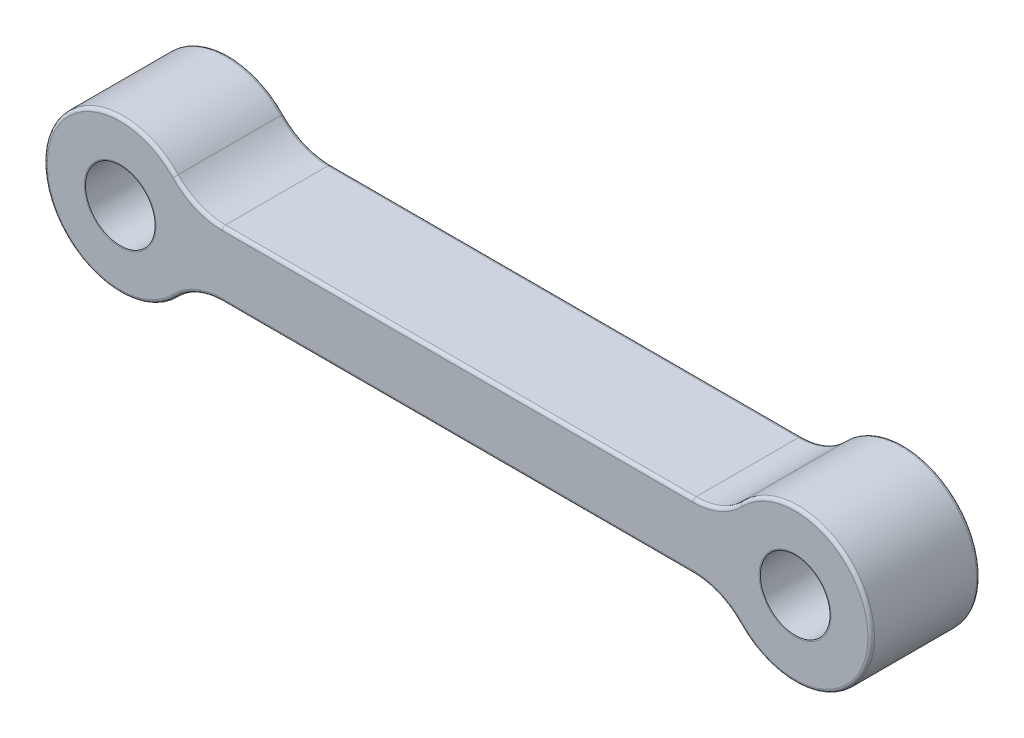
ISO-10303-21;
HEADER;
FILE_DESCRIPTION(('STEP AP214'),'2;1');
FILE_NAME('part.step','',(''),(''),'','','');
FILE_SCHEMA(('AUTOMOTIVE_DESIGN { 1 0 10303 214 1 1 1 1 }'));
ENDSEC;
DATA;
#1=APPLICATION_CONTEXT('core data for automotive mechanical design processes');
#2=APPLICATION_PROTOCOL_DEFINITION('international standard','automotive_design',2000,#1);
#3=PRODUCT_CONTEXT('',#1,'mechanical');
#4=PRODUCT('Part','Part','',(#3));
#5=PRODUCT_RELATED_PRODUCT_CATEGORY('part','',(#4));
#6=PRODUCT_DEFINITION_FORMATION('','',#4);
#7=PRODUCT_DEFINITION_CONTEXT('part definition',#1,'design');
#8=PRODUCT_DEFINITION('design','',#6,#7);
#9=PRODUCT_DEFINITION_SHAPE('','',#8);
#10=(LENGTH_UNIT() NAMED_UNIT(*) SI_UNIT(.MILLI.,.METRE.));
#11=(NAMED_UNIT(*) PLANE_ANGLE_UNIT() SI_UNIT($,.RADIAN.));
#12=(NAMED_UNIT(*) SI_UNIT($,.STERADIAN.) SOLID_ANGLE_UNIT());
#13=UNCERTAINTY_MEASURE_WITH_UNIT(LENGTH_MEASURE(1.E-05),#10,'distance_accuracy_value','');
#14=(GEOMETRIC_REPRESENTATION_CONTEXT(3) GLOBAL_UNCERTAINTY_ASSIGNED_CONTEXT((#13)) GLOBAL_UNIT_ASSIGNED_CONTEXT((#10,
#11,#12)) REPRESENTATION_CONTEXT('',''));
#15=CARTESIAN_POINT('',(0.,0.,0.));
#16=DIRECTION('',(0.,0.,1.));
#17=DIRECTION('',(1.,0.,0.));
#18=AXIS2_PLACEMENT_3D('',#15,#16,#17);
#19=CARTESIAN_POINT('',(0.,1.5,2.5));
#20=DIRECTION('',(0.,-1.,0.));
#21=DIRECTION('',(0.,0.,-1.));
#22=AXIS2_PLACEMENT_3D('',#19,#20,#21);
#23=PLANE('',#22);
#24=DIRECTION('',(0.,0.,-1.));
#25=VECTOR('',#24,1.);
#26=CARTESIAN_POINT('',(26.3095842401766,1.5,2.5));
#27=LINE('',#26,#25);
#28=CARTESIAN_POINT('',(26.3095842401766,1.5,2.35));
#29=VERTEX_POINT('',#28);
#30=CARTESIAN_POINT('',(26.3095842401766,1.5,-2.35));
#31=VERTEX_POINT('',#30);
#32=EDGE_CURVE('E295',#29,#31,#27,.T.);
#33=ORIENTED_EDGE('',*,*,#32,.T.);
#34=DIRECTION('',(-1.,0.,0.));
#35=VECTOR('',#34,1.);
#36=CARTESIAN_POINT('',(0.,1.5,-2.35));
#37=LINE('',#36,#35);
#38=CARTESIAN_POINT('',(4.69041575982343,1.5,-2.35));
#39=VERTEX_POINT('',#38);
#40=EDGE_CURVE('E220',#31,#39,#37,.T.);
#41=ORIENTED_EDGE('',*,*,#40,.T.);
#42=DIRECTION('',(0.,0.,1.));
#43=VECTOR('',#42,1.);
#44=CARTESIAN_POINT('',(4.69041575982343,1.5,2.5));
#45=LINE('',#44,#43);
#46=CARTESIAN_POINT('',(4.69041575982343,1.5,2.35));
#47=VERTEX_POINT('',#46);
#48=EDGE_CURVE('E298',#39,#47,#45,.T.);
#49=ORIENTED_EDGE('',*,*,#48,.T.);
#50=DIRECTION('',(-1.,0.,0.));
#51=VECTOR('',#50,1.);
#52=CARTESIAN_POINT('',(26.3095842401766,1.5,2.35));
#53=LINE('',#52,#51);
#54=EDGE_CURVE('E218',#47,#29,#53,.F.);
#55=ORIENTED_EDGE('',*,*,#54,.T.);
#56=EDGE_LOOP('',(#33,#41,#49,#55));
#57=FACE_BOUND('',#56,.T.);
#58=ADVANCED_FACE('F37',(#57),#23,.F.);
#59=CARTESIAN_POINT('',(0.,0.,2.5));
#60=DIRECTION('',(0.,0.,-1.));
#61=DIRECTION('',(-1.,0.,0.));
#62=AXIS2_PLACEMENT_3D('',#59,#60,#61);
#63=CYLINDRICAL_SURFACE('',#62,3.5);
#64=DIRECTION('',(0.,0.,-1.));
#65=VECTOR('',#64,1.);
#66=CARTESIAN_POINT('',(2.52560848605877,2.42307692307692,2.5));
#67=LINE('',#66,#65);
#68=CARTESIAN_POINT('',(2.52560848605877,2.42307692307692,2.35));
#69=VERTEX_POINT('',#68);
#70=CARTESIAN_POINT('',(2.52560848605877,2.42307692307692,-2.35));
#71=VERTEX_POINT('',#70);
#72=EDGE_CURVE('E292',#69,#71,#67,.T.);
#73=ORIENTED_EDGE('',*,*,#72,.T.);
#74=CARTESIAN_POINT('',(0.,0.,-2.35));
#75=DIRECTION('',(0.,0.,1.));
#76=DIRECTION('',(1.,0.,0.));
#77=AXIS2_PLACEMENT_3D('',#74,#75,#76);
#78=CIRCLE('',#77,3.5);
#79=CARTESIAN_POINT('',(2.52560848605877,-2.42307692307692,-2.35));
#80=VERTEX_POINT('',#79);
#81=EDGE_CURVE('E195',#71,#80,#78,.T.);
#82=ORIENTED_EDGE('',*,*,#81,.T.);
#83=DIRECTION('',(0.,0.,-1.));
#84=VECTOR('',#83,1.);
#85=CARTESIAN_POINT('',(2.52560848605877,-2.42307692307692,2.5));
#86=LINE('',#85,#84);
#87=CARTESIAN_POINT('',(2.52560848605877,-2.42307692307692,2.35));
#88=VERTEX_POINT('',#87);
#89=EDGE_CURVE('E255',#80,#88,#86,.F.);
#90=ORIENTED_EDGE('',*,*,#89,.T.);
#91=CARTESIAN_POINT('',(0.,0.,2.35));
#92=DIRECTION('',(0.,0.,1.));
#93=DIRECTION('',(1.,0.,0.));
#94=AXIS2_PLACEMENT_3D('',#91,#92,#93);
#95=CIRCLE('',#94,3.5);
#96=EDGE_CURVE('E193',#88,#69,#95,.F.);
#97=ORIENTED_EDGE('',*,*,#96,.T.);
#98=EDGE_LOOP('',(#73,#82,#90,#97));
#99=FACE_BOUND('',#98,.T.);
#100=ADVANCED_FACE('F335',(#99),#63,.T.);
#101=CARTESIAN_POINT('',(0.,-1.5,2.5));
#102=DIRECTION('',(0.,-1.,0.));
#103=DIRECTION('',(0.,0.,-1.));
#104=AXIS2_PLACEMENT_3D('',#101,#102,#103);
#105=PLANE('',#104);
#106=DIRECTION('',(0.,0.,-1.));
#107=VECTOR('',#106,1.);
#108=CARTESIAN_POINT('',(4.69041575982343,-1.5,2.5));
#109=LINE('',#108,#107);
#110=CARTESIAN_POINT('',(4.69041575982343,-1.5,2.35));
#111=VERTEX_POINT('',#110);
#112=CARTESIAN_POINT('',(4.69041575982343,-1.5,-2.35));
#113=VERTEX_POINT('',#112);
#114=EDGE_CURVE('E173',#111,#113,#109,.T.);
#115=ORIENTED_EDGE('',*,*,#114,.T.);
#116=DIRECTION('',(-1.,0.,0.));
#117=VECTOR('',#116,1.);
#118=CARTESIAN_POINT('',(26.3095842401766,-1.5,-2.35));
#119=LINE('',#118,#117);
#120=CARTESIAN_POINT('',(26.3095842401766,-1.5,-2.35));
#121=VERTEX_POINT('',#120);
#122=EDGE_CURVE('E203',#113,#121,#119,.F.);
#123=ORIENTED_EDGE('',*,*,#122,.T.);
#124=DIRECTION('',(0.,0.,1.));
#125=VECTOR('',#124,1.);
#126=CARTESIAN_POINT('',(26.3095842401766,-1.5,2.5));
#127=LINE('',#126,#125);
#128=CARTESIAN_POINT('',(26.3095842401766,-1.5,2.35));
#129=VERTEX_POINT('',#128);
#130=EDGE_CURVE('E307',#121,#129,#127,.T.);
#131=ORIENTED_EDGE('',*,*,#130,.T.);
#132=DIRECTION('',(-1.,0.,0.));
#133=VECTOR('',#132,1.);
#134=CARTESIAN_POINT('',(0.,-1.5,2.35));
#135=LINE('',#134,#133);
#136=EDGE_CURVE('E201',#129,#111,#135,.T.);
#137=ORIENTED_EDGE('',*,*,#136,.T.);
#138=EDGE_LOOP('',(#115,#123,#131,#137));
#139=FACE_BOUND('',#138,.T.);
#140=ADVANCED_FACE('F383',(#139),#105,.T.);
#141=CARTESIAN_POINT('',(31.,0.,2.5));
#142=DIRECTION('',(0.,0.,-1.));
#143=DIRECTION('',(-1.,0.,0.));
#144=AXIS2_PLACEMENT_3D('',#141,#142,#143);
#145=CYLINDRICAL_SURFACE('',#144,3.5);
#146=DIRECTION('',(0.,0.,-1.));
#147=VECTOR('',#146,1.);
#148=CARTESIAN_POINT('',(28.4743915139412,-2.42307692307692,2.5));
#149=LINE('',#148,#147);
#150=CARTESIAN_POINT('',(28.4743915139412,-2.42307692307692,2.35));
#151=VERTEX_POINT('',#150);
#152=CARTESIAN_POINT('',(28.4743915139412,-2.42307692307692,-2.35));
#153=VERTEX_POINT('',#152);
#154=EDGE_CURVE('E301',#151,#153,#149,.T.);
#155=ORIENTED_EDGE('',*,*,#154,.T.);
#156=CARTESIAN_POINT('',(31.,0.,-2.35));
#157=DIRECTION('',(0.,0.,1.));
#158=DIRECTION('',(1.,0.,0.));
#159=AXIS2_PLACEMENT_3D('',#156,#157,#158);
#160=CIRCLE('',#159,3.5);
#161=CARTESIAN_POINT('',(28.4743915139412,2.42307692307692,-2.35));
#162=VERTEX_POINT('',#161);
#163=EDGE_CURVE('E212',#153,#162,#160,.T.);
#164=ORIENTED_EDGE('',*,*,#163,.T.);
#165=DIRECTION('',(0.,0.,-1.));
#166=VECTOR('',#165,1.);
#167=CARTESIAN_POINT('',(28.4743915139412,2.42307692307692,2.5));
#168=LINE('',#167,#166);
#169=CARTESIAN_POINT('',(28.4743915139412,2.42307692307692,2.35));
#170=VERTEX_POINT('',#169);
#171=EDGE_CURVE('E304',#162,#170,#168,.F.);
#172=ORIENTED_EDGE('',*,*,#171,.T.);
#173=CARTESIAN_POINT('',(31.,0.,2.35));
#174=DIRECTION('',(0.,0.,1.));
#175=DIRECTION('',(1.,0.,0.));
#176=AXIS2_PLACEMENT_3D('',#173,#174,#175);
#177=CIRCLE('',#176,3.5);
#178=EDGE_CURVE('E210',#170,#151,#177,.F.);
#179=ORIENTED_EDGE('',*,*,#178,.T.);
#180=EDGE_LOOP('',(#155,#164,#172,#179));
#181=FACE_BOUND('',#180,.T.);
#182=ADVANCED_FACE('F367',(#181),#145,.T.);
#183=CARTESIAN_POINT('',(0.,0.,2.5));
#184=DIRECTION('',(0.,0.,1.));
#185=DIRECTION('',(1.,0.,0.));
#186=AXIS2_PLACEMENT_3D('',#183,#184,#185);
#187=PLANE('',#186);
#188=CARTESIAN_POINT('',(31.,0.,2.5));
#189=DIRECTION('',(0.,0.,1.));
#190=DIRECTION('',(1.,0.,0.));
#191=AXIS2_PLACEMENT_3D('',#188,#189,#190);
#192=CIRCLE('',#191,1.65);
#193=CARTESIAN_POINT('',(32.65,0.,2.5));
#194=VERTEX_POINT('',#193);
#195=EDGE_CURVE('E11',#194,#194,#192,.F.);
#196=ORIENTED_EDGE('',*,*,#195,.T.);
#197=EDGE_LOOP('',(#196));
#198=FACE_BOUND('',#197,.T.);
#199=CARTESIAN_POINT('',(0.,0.,2.5));
#200=DIRECTION('',(0.,0.,1.));
#201=DIRECTION('',(1.,0.,0.));
#202=AXIS2_PLACEMENT_3D('',#199,#200,#201);
#203=CIRCLE('',#202,1.65);
#204=CARTESIAN_POINT('',(1.65,0.,2.5));
#205=VERTEX_POINT('',#204);
#206=EDGE_CURVE('E46',#205,#205,#203,.F.);
#207=ORIENTED_EDGE('',*,*,#206,.T.);
#208=EDGE_LOOP('',(#207));
#209=FACE_BOUND('',#208,.T.);
#210=DIRECTION('',(-1.,0.,0.));
#211=VECTOR('',#210,1.);
#212=CARTESIAN_POINT('',(0.,-1.35,2.5));
#213=LINE('',#212,#211);
#214=CARTESIAN_POINT('',(4.69041575982343,-1.35,2.5));
#215=VERTEX_POINT('',#214);
#216=CARTESIAN_POINT('',(26.3095842401766,-1.35,2.5));
#217=VERTEX_POINT('',#216);
#218=EDGE_CURVE('E54',#215,#217,#213,.F.);
#219=ORIENTED_EDGE('',*,*,#218,.T.);
#220=CARTESIAN_POINT('',(26.3095842401766,-4.5,2.5));
#221=DIRECTION('',(0.,0.,1.));
#222=DIRECTION('',(1.,0.,0.));
#223=AXIS2_PLACEMENT_3D('',#220,#221,#222);
#224=CIRCLE('',#223,3.15);
#225=CARTESIAN_POINT('',(28.5826318776295,-2.31923076923077,2.5));
#226=VERTEX_POINT('',#225);
#227=EDGE_CURVE('E234',#217,#226,#224,.F.);
#228=ORIENTED_EDGE('',*,*,#227,.T.);
#229=CARTESIAN_POINT('',(31.,0.,2.5));
#230=DIRECTION('',(0.,0.,1.));
#231=DIRECTION('',(1.,0.,0.));
#232=AXIS2_PLACEMENT_3D('',#229,#230,#231);
#233=CIRCLE('',#232,3.35);
#234=CARTESIAN_POINT('',(28.5826318776295,2.31923076923077,2.5));
#235=VERTEX_POINT('',#234);
#236=EDGE_CURVE('E222',#226,#235,#233,.T.);
#237=ORIENTED_EDGE('',*,*,#236,.T.);
#238=CARTESIAN_POINT('',(26.3095842401766,4.5,2.5));
#239=DIRECTION('',(0.,0.,1.));
#240=DIRECTION('',(1.,0.,0.));
#241=AXIS2_PLACEMENT_3D('',#238,#239,#240);
#242=CIRCLE('',#241,3.15);
#243=CARTESIAN_POINT('',(26.3095842401766,1.35,2.5));
#244=VERTEX_POINT('',#243);
#245=EDGE_CURVE('E224',#235,#244,#242,.F.);
#246=ORIENTED_EDGE('',*,*,#245,.T.);
#247=DIRECTION('',(-1.,0.,0.));
#248=VECTOR('',#247,1.);
#249=CARTESIAN_POINT('',(4.69041575982343,1.35,2.5));
#250=LINE('',#249,#248);
#251=CARTESIAN_POINT('',(4.69041575982343,1.35,2.5));
#252=VERTEX_POINT('',#251);
#253=EDGE_CURVE('E226',#244,#252,#250,.T.);
#254=ORIENTED_EDGE('',*,*,#253,.T.);
#255=CARTESIAN_POINT('',(4.69041575982343,4.5,2.5));
#256=DIRECTION('',(0.,0.,1.));
#257=DIRECTION('',(1.,0.,0.));
#258=AXIS2_PLACEMENT_3D('',#255,#256,#257);
#259=CIRCLE('',#258,3.15);
#260=CARTESIAN_POINT('',(2.41736812237054,2.31923076923077,2.5));
#261=VERTEX_POINT('',#260);
#262=EDGE_CURVE('E228',#252,#261,#259,.F.);
#263=ORIENTED_EDGE('',*,*,#262,.T.);
#264=CARTESIAN_POINT('',(0.,0.,2.5));
#265=DIRECTION('',(0.,0.,1.));
#266=DIRECTION('',(1.,0.,0.));
#267=AXIS2_PLACEMENT_3D('',#264,#265,#266);
#268=CIRCLE('',#267,3.35);
#269=CARTESIAN_POINT('',(2.41736812237054,-2.31923076923077,2.5));
#270=VERTEX_POINT('',#269);
#271=EDGE_CURVE('E230',#261,#270,#268,.T.);
#272=ORIENTED_EDGE('',*,*,#271,.T.);
#273=CARTESIAN_POINT('',(4.69041575982343,-4.5,2.5));
#274=DIRECTION('',(0.,0.,1.));
#275=DIRECTION('',(1.,0.,0.));
#276=AXIS2_PLACEMENT_3D('',#273,#274,#275);
#277=CIRCLE('',#276,3.15);
#278=EDGE_CURVE('E59',#270,#215,#277,.F.);
#279=ORIENTED_EDGE('',*,*,#278,.T.);
#280=EDGE_LOOP('',(#219,#228,#237,#246,#254,#263,#272,#279));
#281=FACE_BOUND('',#280,.T.);
#282=ADVANCED_FACE('F354',(#198,#209,#281),#187,.T.);
#283=CARTESIAN_POINT('',(0.,0.,-2.5));
#284=DIRECTION('',(0.,0.,1.));
#285=DIRECTION('',(1.,0.,0.));
#286=AXIS2_PLACEMENT_3D('',#283,#284,#285);
#287=PLANE('',#286);
#288=CARTESIAN_POINT('',(31.,0.,-2.5));
#289=DIRECTION('',(0.,0.,1.));
#290=DIRECTION('',(1.,0.,0.));
#291=AXIS2_PLACEMENT_3D('',#288,#289,#290);
#292=CIRCLE('',#291,1.65);
#293=CARTESIAN_POINT('',(32.65,0.,-2.5));
#294=VERTEX_POINT('',#293);
#295=EDGE_CURVE('E182',#294,#294,#292,.T.);
#296=ORIENTED_EDGE('',*,*,#295,.T.);
#297=EDGE_LOOP('',(#296));
#298=FACE_BOUND('',#297,.T.);
#299=CARTESIAN_POINT('',(0.,0.,-2.5));
#300=DIRECTION('',(0.,0.,1.));
#301=DIRECTION('',(1.,0.,0.));
#302=AXIS2_PLACEMENT_3D('',#299,#300,#301);
#303=CIRCLE('',#302,1.65);
#304=CARTESIAN_POINT('',(1.65,0.,-2.5));
#305=VERTEX_POINT('',#304);
#306=EDGE_CURVE('E179',#305,#305,#303,.T.);
#307=ORIENTED_EDGE('',*,*,#306,.T.);
#308=EDGE_LOOP('',(#307));
#309=FACE_BOUND('',#308,.T.);
#310=CARTESIAN_POINT('',(0.,0.,-2.5));
#311=DIRECTION('',(0.,0.,1.));
#312=DIRECTION('',(1.,0.,0.));
#313=AXIS2_PLACEMENT_3D('',#310,#311,#312);
#314=CIRCLE('',#313,3.35);
#315=CARTESIAN_POINT('',(2.41736812237054,-2.31923076923077,-2.5));
#316=VERTEX_POINT('',#315);
#317=CARTESIAN_POINT('',(2.41736812237054,2.31923076923077,-2.5));
#318=VERTEX_POINT('',#317);
#319=EDGE_CURVE('E177',#316,#318,#314,.F.);
#320=ORIENTED_EDGE('',*,*,#319,.T.);
#321=CARTESIAN_POINT('',(4.69041575982343,4.5,-2.5));
#322=DIRECTION('',(0.,0.,1.));
#323=DIRECTION('',(1.,0.,0.));
#324=AXIS2_PLACEMENT_3D('',#321,#322,#323);
#325=CIRCLE('',#324,3.15);
#326=CARTESIAN_POINT('',(4.69041575982343,1.35,-2.5));
#327=VERTEX_POINT('',#326);
#328=EDGE_CURVE('E157',#318,#327,#325,.T.);
#329=ORIENTED_EDGE('',*,*,#328,.T.);
#330=DIRECTION('',(-1.,0.,0.));
#331=VECTOR('',#330,1.);
#332=CARTESIAN_POINT('',(0.,1.35,-2.5));
#333=LINE('',#332,#331);
#334=CARTESIAN_POINT('',(26.3095842401766,1.35,-2.5));
#335=VERTEX_POINT('',#334);
#336=EDGE_CURVE('E166',#327,#335,#333,.F.);
#337=ORIENTED_EDGE('',*,*,#336,.T.);
#338=CARTESIAN_POINT('',(26.3095842401766,4.5,-2.5));
#339=DIRECTION('',(0.,0.,1.));
#340=DIRECTION('',(1.,0.,0.));
#341=AXIS2_PLACEMENT_3D('',#338,#339,#340);
#342=CIRCLE('',#341,3.15);
#343=CARTESIAN_POINT('',(28.5826318776295,2.31923076923077,-2.5));
#344=VERTEX_POINT('',#343);
#345=EDGE_CURVE('E172',#335,#344,#342,.T.);
#346=ORIENTED_EDGE('',*,*,#345,.T.);
#347=CARTESIAN_POINT('',(31.,0.,-2.5));
#348=DIRECTION('',(0.,0.,1.));
#349=DIRECTION('',(1.,0.,0.));
#350=AXIS2_PLACEMENT_3D('',#347,#348,#349);
#351=CIRCLE('',#350,3.35);
#352=CARTESIAN_POINT('',(28.5826318776295,-2.31923076923077,-2.5));
#353=VERTEX_POINT('',#352);
#354=EDGE_CURVE('E313',#344,#353,#351,.F.);
#355=ORIENTED_EDGE('',*,*,#354,.T.);
#356=CARTESIAN_POINT('',(26.3095842401766,-4.5,-2.5));
#357=DIRECTION('',(0.,0.,1.));
#358=DIRECTION('',(1.,0.,0.));
#359=AXIS2_PLACEMENT_3D('',#356,#357,#358);
#360=CIRCLE('',#359,3.15);
#361=CARTESIAN_POINT('',(26.3095842401766,-1.35,-2.5));
#362=VERTEX_POINT('',#361);
#363=EDGE_CURVE('E315',#353,#362,#360,.T.);
#364=ORIENTED_EDGE('',*,*,#363,.T.);
#365=DIRECTION('',(-1.,0.,0.));
#366=VECTOR('',#365,1.);
#367=CARTESIAN_POINT('',(4.69041575982343,-1.35,-2.5));
#368=LINE('',#367,#366);
#369=CARTESIAN_POINT('',(4.69041575982343,-1.35,-2.5));
#370=VERTEX_POINT('',#369);
#371=EDGE_CURVE('E317',#362,#370,#368,.T.);
#372=ORIENTED_EDGE('',*,*,#371,.T.);
#373=CARTESIAN_POINT('',(4.69041575982343,-4.5,-2.5));
#374=DIRECTION('',(0.,0.,1.));
#375=DIRECTION('',(1.,0.,0.));
#376=AXIS2_PLACEMENT_3D('',#373,#374,#375);
#377=CIRCLE('',#376,3.15);
#378=EDGE_CURVE('E184',#370,#316,#377,.T.);
#379=ORIENTED_EDGE('',*,*,#378,.T.);
#380=EDGE_LOOP('',(#320,#329,#337,#346,#355,#364,#372,#379));
#381=FACE_BOUND('',#380,.T.);
#382=ADVANCED_FACE('F175',(#298,#309,#381),#287,.F.);
#383=CARTESIAN_POINT('',(4.69041575982343,4.5,2.5));
#384=DIRECTION('',(0.,0.,-1.));
#385=DIRECTION('',(-1.,0.,0.));
#386=AXIS2_PLACEMENT_3D('',#383,#384,#385);
#387=CYLINDRICAL_SURFACE('',#386,3.);
#388=ORIENTED_EDGE('',*,*,#48,.F.);
#389=CARTESIAN_POINT('',(4.69041575982343,4.5,-2.35));
#390=DIRECTION('',(0.,0.,1.));
#391=DIRECTION('',(1.,0.,0.));
#392=AXIS2_PLACEMENT_3D('',#389,#390,#391);
#393=CIRCLE('',#392,3.);
#394=EDGE_CURVE('E159',#39,#71,#393,.F.);
#395=ORIENTED_EDGE('',*,*,#394,.T.);
#396=ORIENTED_EDGE('',*,*,#72,.F.);
#397=CARTESIAN_POINT('',(4.69041575982343,4.5,2.35));
#398=DIRECTION('',(0.,0.,1.));
#399=DIRECTION('',(1.,0.,0.));
#400=AXIS2_PLACEMENT_3D('',#397,#398,#399);
#401=CIRCLE('',#400,3.);
#402=EDGE_CURVE('E190',#69,#47,#401,.T.);
#403=ORIENTED_EDGE('',*,*,#402,.T.);
#404=EDGE_LOOP('',(#388,#395,#396,#403));
#405=FACE_BOUND('',#404,.T.);
#406=ADVANCED_FACE('F333',(#405),#387,.F.);
#407=CARTESIAN_POINT('',(26.3095842401766,4.5,2.5));
#408=DIRECTION('',(0.,0.,-1.));
#409=DIRECTION('',(-1.,0.,0.));
#410=AXIS2_PLACEMENT_3D('',#407,#408,#409);
#411=CYLINDRICAL_SURFACE('',#410,3.);
#412=ORIENTED_EDGE('',*,*,#171,.F.);
#413=CARTESIAN_POINT('',(26.3095842401766,4.5,-2.35));
#414=DIRECTION('',(0.,0.,1.));
#415=DIRECTION('',(1.,0.,0.));
#416=AXIS2_PLACEMENT_3D('',#413,#414,#415);
#417=CIRCLE('',#416,3.);
#418=EDGE_CURVE('E216',#162,#31,#417,.F.);
#419=ORIENTED_EDGE('',*,*,#418,.T.);
#420=ORIENTED_EDGE('',*,*,#32,.F.);
#421=CARTESIAN_POINT('',(26.3095842401766,4.5,2.35));
#422=DIRECTION('',(0.,0.,1.));
#423=DIRECTION('',(1.,0.,0.));
#424=AXIS2_PLACEMENT_3D('',#421,#422,#423);
#425=CIRCLE('',#424,3.);
#426=EDGE_CURVE('E214',#29,#170,#425,.T.);
#427=ORIENTED_EDGE('',*,*,#426,.T.);
#428=EDGE_LOOP('',(#412,#419,#420,#427));
#429=FACE_BOUND('',#428,.T.);
#430=ADVANCED_FACE('F388',(#429),#411,.F.);
#431=CARTESIAN_POINT('',(4.69041575982343,-4.5,2.5));
#432=DIRECTION('',(0.,0.,-1.));
#433=DIRECTION('',(-1.,0.,0.));
#434=AXIS2_PLACEMENT_3D('',#431,#432,#433);
#435=CYLINDRICAL_SURFACE('',#434,3.);
#436=ORIENTED_EDGE('',*,*,#89,.F.);
#437=CARTESIAN_POINT('',(4.69041575982343,-4.5,-2.35));
#438=DIRECTION('',(0.,0.,1.));
#439=DIRECTION('',(1.,0.,0.));
#440=AXIS2_PLACEMENT_3D('',#437,#438,#439);
#441=CIRCLE('',#440,3.);
#442=EDGE_CURVE('E199',#80,#113,#441,.F.);
#443=ORIENTED_EDGE('',*,*,#442,.T.);
#444=ORIENTED_EDGE('',*,*,#114,.F.);
#445=CARTESIAN_POINT('',(4.69041575982343,-4.5,2.35));
#446=DIRECTION('',(0.,0.,1.));
#447=DIRECTION('',(1.,0.,0.));
#448=AXIS2_PLACEMENT_3D('',#445,#446,#447);
#449=CIRCLE('',#448,3.);
#450=EDGE_CURVE('E197',#111,#88,#449,.T.);
#451=ORIENTED_EDGE('',*,*,#450,.T.);
#452=EDGE_LOOP('',(#436,#443,#444,#451));
#453=FACE_BOUND('',#452,.T.);
#454=ADVANCED_FACE('F386',(#453),#435,.F.);
#455=CARTESIAN_POINT('',(26.3095842401766,-4.5,2.5));
#456=DIRECTION('',(0.,0.,-1.));
#457=DIRECTION('',(-1.,0.,0.));
#458=AXIS2_PLACEMENT_3D('',#455,#456,#457);
#459=CYLINDRICAL_SURFACE('',#458,3.);
#460=ORIENTED_EDGE('',*,*,#130,.F.);
#461=CARTESIAN_POINT('',(26.3095842401766,-4.5,-2.35));
#462=DIRECTION('',(0.,0.,1.));
#463=DIRECTION('',(1.,0.,0.));
#464=AXIS2_PLACEMENT_3D('',#461,#462,#463);
#465=CIRCLE('',#464,3.);
#466=EDGE_CURVE('E208',#121,#153,#465,.F.);
#467=ORIENTED_EDGE('',*,*,#466,.T.);
#468=ORIENTED_EDGE('',*,*,#154,.F.);
#469=CARTESIAN_POINT('',(26.3095842401766,-4.5,2.35));
#470=DIRECTION('',(0.,0.,1.));
#471=DIRECTION('',(1.,0.,0.));
#472=AXIS2_PLACEMENT_3D('',#469,#470,#471);
#473=CIRCLE('',#472,3.);
#474=EDGE_CURVE('E205',#151,#129,#473,.T.);
#475=ORIENTED_EDGE('',*,*,#474,.T.);
#476=EDGE_LOOP('',(#460,#467,#468,#475));
#477=FACE_BOUND('',#476,.T.);
#478=ADVANCED_FACE('F372',(#477),#459,.F.);
#479=CARTESIAN_POINT('',(31.,0.,-2.35));
#480=DIRECTION('',(0.,0.,1.));
#481=DIRECTION('',(1.,0.,0.));
#482=AXIS2_PLACEMENT_3D('',#479,#480,#481);
#483=TOROIDAL_SURFACE('',#482,1.65,0.15);
#484=CARTESIAN_POINT('',(31.,0.,-2.49142135623731));
#485=DIRECTION('',(0.,0.,1.));
#486=DIRECTION('',(1.,0.,0.));
#487=AXIS2_PLACEMENT_3D('',#484,#485,#486);
#488=CIRCLE('',#487,1.6);
#489=CARTESIAN_POINT('',(32.6,0.,-2.49142135623731));
#490=VERTEX_POINT('',#489);
#491=EDGE_CURVE('E279',#490,#490,#488,.F.);
#492=ORIENTED_EDGE('',*,*,#491,.F.);
#493=EDGE_LOOP('',(#492));
#494=FACE_BOUND('',#493,.T.);
#495=ORIENTED_EDGE('',*,*,#295,.F.);
#496=EDGE_LOOP('',(#495));
#497=FACE_BOUND('',#496,.T.);
#498=ADVANCED_FACE('F394',(#494,#497),#483,.T.);
#499=CARTESIAN_POINT('',(0.,0.,-2.35));
#500=DIRECTION('',(0.,0.,1.));
#501=DIRECTION('',(1.,0.,0.));
#502=AXIS2_PLACEMENT_3D('',#499,#500,#501);
#503=TOROIDAL_SURFACE('',#502,1.65,0.15);
#504=CARTESIAN_POINT('',(0.,0.,-2.49142135623731));
#505=DIRECTION('',(0.,0.,1.));
#506=DIRECTION('',(1.,0.,0.));
#507=AXIS2_PLACEMENT_3D('',#504,#505,#506);
#508=CIRCLE('',#507,1.6);
#509=CARTESIAN_POINT('',(1.6,0.,-2.49142135623731));
#510=VERTEX_POINT('',#509);
#511=EDGE_CURVE('E277',#510,#510,#508,.F.);
#512=ORIENTED_EDGE('',*,*,#511,.F.);
#513=EDGE_LOOP('',(#512));
#514=FACE_BOUND('',#513,.T.);
#515=ORIENTED_EDGE('',*,*,#306,.F.);
#516=EDGE_LOOP('',(#515));
#517=FACE_BOUND('',#516,.T.);
#518=ADVANCED_FACE('F473',(#514,#517),#503,.T.);
#519=CARTESIAN_POINT('',(26.3095842401766,-4.5,-2.35));
#520=DIRECTION('',(0.,0.,1.));
#521=DIRECTION('',(1.,0.,0.));
#522=AXIS2_PLACEMENT_3D('',#519,#520,#521);
#523=TOROIDAL_SURFACE('',#522,3.15,0.15);
#524=CARTESIAN_POINT('',(28.5826318776295,-2.31923076923077,-2.35));
#525=DIRECTION('',(0.692307692307697,-0.721602424588216,0.));
#526=DIRECTION('',(0.721602424588216,0.692307692307697,0.));
#527=AXIS2_PLACEMENT_3D('',#524,#525,#526);
#528=CIRCLE('',#527,0.15);
#529=EDGE_CURVE('E249',#153,#353,#528,.T.);
#530=ORIENTED_EDGE('',*,*,#529,.F.);
#531=ORIENTED_EDGE('',*,*,#466,.F.);
#532=CARTESIAN_POINT('',(26.3095842401766,-1.35,-2.35));
#533=DIRECTION('',(-1.,0.,0.));
#534=DIRECTION('',(0.,0.,1.));
#535=AXIS2_PLACEMENT_3D('',#532,#533,#534);
#536=CIRCLE('',#535,0.15);
#537=EDGE_CURVE('E252',#362,#121,#536,.T.);
#538=ORIENTED_EDGE('',*,*,#537,.F.);
#539=ORIENTED_EDGE('',*,*,#363,.F.);
#540=EDGE_LOOP('',(#530,#531,#538,#539));
#541=FACE_BOUND('',#540,.T.);
#542=ADVANCED_FACE('F376',(#541),#523,.T.);
#543=CARTESIAN_POINT('',(0.,-1.35,-2.35));
#544=DIRECTION('',(1.,0.,0.));
#545=DIRECTION('',(0.,0.,-1.));
#546=AXIS2_PLACEMENT_3D('',#543,#544,#545);
#547=CYLINDRICAL_SURFACE('',#546,0.15);
#548=ORIENTED_EDGE('',*,*,#537,.T.);
#549=ORIENTED_EDGE('',*,*,#122,.F.);
#550=CARTESIAN_POINT('',(4.69041575982343,-1.35,-2.35));
#551=DIRECTION('',(-1.,0.,0.));
#552=DIRECTION('',(0.,0.,1.));
#553=AXIS2_PLACEMENT_3D('',#550,#551,#552);
#554=CIRCLE('',#553,0.15);
#555=EDGE_CURVE('E246',#370,#113,#554,.T.);
#556=ORIENTED_EDGE('',*,*,#555,.F.);
#557=ORIENTED_EDGE('',*,*,#371,.F.);
#558=EDGE_LOOP('',(#548,#549,#556,#557));
#559=FACE_BOUND('',#558,.T.);
#560=ADVANCED_FACE('F381',(#559),#547,.T.);
#561=CARTESIAN_POINT('',(31.,0.,-2.35));
#562=DIRECTION('',(0.,0.,1.));
#563=DIRECTION('',(1.,0.,0.));
#564=AXIS2_PLACEMENT_3D('',#561,#562,#563);
#565=TOROIDAL_SURFACE('',#564,3.35,0.15);
#566=ORIENTED_EDGE('',*,*,#529,.T.);
#567=ORIENTED_EDGE('',*,*,#354,.F.);
#568=CARTESIAN_POINT('',(28.5826318776295,2.31923076923077,-2.35));
#569=DIRECTION('',(-0.692307692307698,-0.721602424588214,0.));
#570=DIRECTION('',(0.721602424588214,-0.692307692307698,0.));
#571=AXIS2_PLACEMENT_3D('',#568,#569,#570);
#572=CIRCLE('',#571,0.15);
#573=EDGE_CURVE('E243',#162,#344,#572,.T.);
#574=ORIENTED_EDGE('',*,*,#573,.F.);
#575=ORIENTED_EDGE('',*,*,#163,.F.);
#576=EDGE_LOOP('',(#566,#567,#574,#575));
#577=FACE_BOUND('',#576,.T.);
#578=ADVANCED_FACE('F484',(#577),#565,.T.);
#579=CARTESIAN_POINT('',(4.69041575982343,-4.5,-2.35));
#580=DIRECTION('',(0.,0.,1.));
#581=DIRECTION('',(1.,0.,0.));
#582=AXIS2_PLACEMENT_3D('',#579,#580,#581);
#583=TOROIDAL_SURFACE('',#582,3.15,0.15);
#584=ORIENTED_EDGE('',*,*,#555,.T.);
#585=ORIENTED_EDGE('',*,*,#442,.F.);
#586=CARTESIAN_POINT('',(2.41736812237054,-2.31923076923077,-2.35));
#587=DIRECTION('',(-0.692307692307693,-0.72160242458822,0.));
#588=DIRECTION('',(0.72160242458822,-0.692307692307693,0.));
#589=AXIS2_PLACEMENT_3D('',#586,#587,#588);
#590=CIRCLE('',#589,0.15);
#591=EDGE_CURVE('E240',#316,#80,#590,.T.);
#592=ORIENTED_EDGE('',*,*,#591,.F.);
#593=ORIENTED_EDGE('',*,*,#378,.F.);
#594=EDGE_LOOP('',(#584,#585,#592,#593));
#595=FACE_BOUND('',#594,.T.);
#596=ADVANCED_FACE('F324',(#595),#583,.T.);
#597=CARTESIAN_POINT('',(26.3095842401766,4.5,-2.35));
#598=DIRECTION('',(0.,0.,1.));
#599=DIRECTION('',(1.,0.,0.));
#600=AXIS2_PLACEMENT_3D('',#597,#598,#599);
#601=TOROIDAL_SURFACE('',#600,3.15,0.15);
#602=ORIENTED_EDGE('',*,*,#573,.T.);
#603=ORIENTED_EDGE('',*,*,#345,.F.);
#604=CARTESIAN_POINT('',(26.3095842401766,1.35,-2.35));
#605=DIRECTION('',(-1.,0.,0.));
#606=DIRECTION('',(0.,0.,1.));
#607=AXIS2_PLACEMENT_3D('',#604,#605,#606);
#608=CIRCLE('',#607,0.15);
#609=EDGE_CURVE('E169',#31,#335,#608,.T.);
#610=ORIENTED_EDGE('',*,*,#609,.F.);
#611=ORIENTED_EDGE('',*,*,#418,.F.);
#612=EDGE_LOOP('',(#602,#603,#610,#611));
#613=FACE_BOUND('',#612,.T.);
#614=ADVANCED_FACE('F502',(#613),#601,.T.);
#615=CARTESIAN_POINT('',(0.,0.,-2.35));
#616=DIRECTION('',(0.,0.,1.));
#617=DIRECTION('',(1.,0.,0.));
#618=AXIS2_PLACEMENT_3D('',#615,#616,#617);
#619=TOROIDAL_SURFACE('',#618,3.35,0.15);
#620=ORIENTED_EDGE('',*,*,#591,.T.);
#621=ORIENTED_EDGE('',*,*,#81,.F.);
#622=CARTESIAN_POINT('',(2.41736812237054,2.31923076923077,-2.35));
#623=DIRECTION('',(0.692307692307693,-0.72160242458822,0.));
#624=DIRECTION('',(0.72160242458822,0.692307692307693,0.));
#625=AXIS2_PLACEMENT_3D('',#622,#623,#624);
#626=CIRCLE('',#625,0.15);
#627=EDGE_CURVE('E162',#318,#71,#626,.T.);
#628=ORIENTED_EDGE('',*,*,#627,.F.);
#629=ORIENTED_EDGE('',*,*,#319,.F.);
#630=EDGE_LOOP('',(#620,#621,#628,#629));
#631=FACE_BOUND('',#630,.T.);
#632=ADVANCED_FACE('F327',(#631),#619,.T.);
#633=CARTESIAN_POINT('',(0.,1.35,-2.35));
#634=DIRECTION('',(-1.,0.,0.));
#635=DIRECTION('',(0.,0.,1.));
#636=AXIS2_PLACEMENT_3D('',#633,#634,#635);
#637=CYLINDRICAL_SURFACE('',#636,0.15);
#638=ORIENTED_EDGE('',*,*,#609,.T.);
#639=ORIENTED_EDGE('',*,*,#336,.F.);
#640=CARTESIAN_POINT('',(4.69041575982343,1.35,-2.35));
#641=DIRECTION('',(-1.,0.,0.));
#642=DIRECTION('',(0.,0.,1.));
#643=AXIS2_PLACEMENT_3D('',#640,#641,#642);
#644=CIRCLE('',#643,0.15);
#645=EDGE_CURVE('E153',#39,#327,#644,.T.);
#646=ORIENTED_EDGE('',*,*,#645,.F.);
#647=ORIENTED_EDGE('',*,*,#40,.F.);
#648=EDGE_LOOP('',(#638,#639,#646,#647));
#649=FACE_BOUND('',#648,.T.);
#650=ADVANCED_FACE('F167',(#649),#637,.T.);
#651=CARTESIAN_POINT('',(4.69041575982343,4.5,-2.35));
#652=DIRECTION('',(0.,0.,1.));
#653=DIRECTION('',(1.,0.,0.));
#654=AXIS2_PLACEMENT_3D('',#651,#652,#653);
#655=TOROIDAL_SURFACE('',#654,3.15,0.15);
#656=ORIENTED_EDGE('',*,*,#627,.T.);
#657=ORIENTED_EDGE('',*,*,#394,.F.);
#658=ORIENTED_EDGE('',*,*,#645,.T.);
#659=ORIENTED_EDGE('',*,*,#328,.F.);
#660=EDGE_LOOP('',(#656,#657,#658,#659));
#661=FACE_BOUND('',#660,.T.);
#662=ADVANCED_FACE('F155',(#661),#655,.T.);
#663=CARTESIAN_POINT('',(31.,0.,2.35));
#664=DIRECTION('',(0.,0.,1.));
#665=DIRECTION('',(1.,0.,0.));
#666=AXIS2_PLACEMENT_3D('',#663,#664,#665);
#667=TOROIDAL_SURFACE('',#666,1.65,0.15);
#668=CARTESIAN_POINT('',(31.,0.,2.49142135623731));
#669=DIRECTION('',(0.,0.,-1.));
#670=DIRECTION('',(-1.,0.,0.));
#671=AXIS2_PLACEMENT_3D('',#668,#669,#670);
#672=CIRCLE('',#671,1.6);
#673=CARTESIAN_POINT('',(29.4,0.,2.49142135623731));
#674=VERTEX_POINT('',#673);
#675=EDGE_CURVE('E41',#674,#674,#672,.F.);
#676=ORIENTED_EDGE('',*,*,#675,.F.);
#677=EDGE_LOOP('',(#676));
#678=FACE_BOUND('',#677,.T.);
#679=ORIENTED_EDGE('',*,*,#195,.F.);
#680=EDGE_LOOP('',(#679));
#681=FACE_BOUND('',#680,.T.);
#682=ADVANCED_FACE('F536',(#678,#681),#667,.T.);
#683=CARTESIAN_POINT('',(0.,0.,2.35));
#684=DIRECTION('',(0.,0.,1.));
#685=DIRECTION('',(1.,0.,0.));
#686=AXIS2_PLACEMENT_3D('',#683,#684,#685);
#687=TOROIDAL_SURFACE('',#686,1.65,0.15);
#688=CARTESIAN_POINT('',(0.,0.,2.49142135623731));
#689=DIRECTION('',(0.,0.,-1.));
#690=DIRECTION('',(-1.,0.,0.));
#691=AXIS2_PLACEMENT_3D('',#688,#689,#690);
#692=CIRCLE('',#691,1.6);
#693=CARTESIAN_POINT('',(-1.6,0.,2.49142135623731));
#694=VERTEX_POINT('',#693);
#695=EDGE_CURVE('E259',#694,#694,#692,.F.);
#696=ORIENTED_EDGE('',*,*,#695,.F.);
#697=EDGE_LOOP('',(#696));
#698=FACE_BOUND('',#697,.T.);
#699=ORIENTED_EDGE('',*,*,#206,.F.);
#700=EDGE_LOOP('',(#699));
#701=FACE_BOUND('',#700,.T.);
#702=ADVANCED_FACE('F547',(#698,#701),#687,.T.);
#703=CARTESIAN_POINT('',(4.69041575982343,4.5,2.35));
#704=DIRECTION('',(0.,0.,1.));
#705=DIRECTION('',(1.,0.,0.));
#706=AXIS2_PLACEMENT_3D('',#703,#704,#705);
#707=TOROIDAL_SURFACE('',#706,3.15,0.15);
#708=CARTESIAN_POINT('',(4.69041575982343,1.35,2.35));
#709=DIRECTION('',(1.,0.,0.));
#710=DIRECTION('',(0.,0.,-1.));
#711=AXIS2_PLACEMENT_3D('',#708,#709,#710);
#712=CIRCLE('',#711,0.15);
#713=EDGE_CURVE('E273',#47,#252,#712,.T.);
#714=ORIENTED_EDGE('',*,*,#713,.F.);
#715=ORIENTED_EDGE('',*,*,#402,.F.);
#716=CARTESIAN_POINT('',(2.41736812237054,2.31923076923077,2.35));
#717=DIRECTION('',(-0.692307692307693,0.72160242458822,0.));
#718=DIRECTION('',(-0.72160242458822,-0.692307692307693,0.));
#719=AXIS2_PLACEMENT_3D('',#716,#717,#718);
#720=CIRCLE('',#719,0.15);
#721=EDGE_CURVE('E163',#261,#69,#720,.T.);
#722=ORIENTED_EDGE('',*,*,#721,.F.);
#723=ORIENTED_EDGE('',*,*,#262,.F.);
#724=EDGE_LOOP('',(#714,#715,#722,#723));
#725=FACE_BOUND('',#724,.T.);
#726=ADVANCED_FACE('F39',(#725),#707,.T.);
#727=CARTESIAN_POINT('',(0.,0.,2.35));
#728=DIRECTION('',(0.,0.,1.));
#729=DIRECTION('',(1.,0.,0.));
#730=AXIS2_PLACEMENT_3D('',#727,#728,#729);
#731=TOROIDAL_SURFACE('',#730,3.35,0.15);
#732=ORIENTED_EDGE('',*,*,#721,.T.);
#733=ORIENTED_EDGE('',*,*,#96,.F.);
#734=CARTESIAN_POINT('',(2.41736812237054,-2.31923076923077,2.35));
#735=DIRECTION('',(0.692307692307693,0.72160242458822,0.));
#736=DIRECTION('',(-0.72160242458822,0.692307692307693,0.));
#737=AXIS2_PLACEMENT_3D('',#734,#735,#736);
#738=CIRCLE('',#737,0.15);
#739=EDGE_CURVE('E270',#270,#88,#738,.T.);
#740=ORIENTED_EDGE('',*,*,#739,.F.);
#741=ORIENTED_EDGE('',*,*,#271,.F.);
#742=EDGE_LOOP('',(#732,#733,#740,#741));
#743=FACE_BOUND('',#742,.T.);
#744=ADVANCED_FACE('F339',(#743),#731,.T.);
#745=CARTESIAN_POINT('',(0.,1.35,2.35));
#746=DIRECTION('',(1.,0.,0.));
#747=DIRECTION('',(0.,0.,-1.));
#748=AXIS2_PLACEMENT_3D('',#745,#746,#747);
#749=CYLINDRICAL_SURFACE('',#748,0.15);
#750=ORIENTED_EDGE('',*,*,#713,.T.);
#751=ORIENTED_EDGE('',*,*,#253,.F.);
#752=CARTESIAN_POINT('',(26.3095842401766,1.35,2.35));
#753=DIRECTION('',(1.,0.,0.));
#754=DIRECTION('',(0.,0.,-1.));
#755=AXIS2_PLACEMENT_3D('',#752,#753,#754);
#756=CIRCLE('',#755,0.15);
#757=EDGE_CURVE('E267',#29,#244,#756,.T.);
#758=ORIENTED_EDGE('',*,*,#757,.F.);
#759=ORIENTED_EDGE('',*,*,#54,.F.);
#760=EDGE_LOOP('',(#750,#751,#758,#759));
#761=FACE_BOUND('',#760,.T.);
#762=ADVANCED_FACE('F558',(#761),#749,.T.);
#763=CARTESIAN_POINT('',(4.69041575982343,-4.5,2.35));
#764=DIRECTION('',(0.,0.,1.));
#765=DIRECTION('',(1.,0.,0.));
#766=AXIS2_PLACEMENT_3D('',#763,#764,#765);
#767=TOROIDAL_SURFACE('',#766,3.15,0.15);
#768=ORIENTED_EDGE('',*,*,#739,.T.);
#769=ORIENTED_EDGE('',*,*,#450,.F.);
#770=CARTESIAN_POINT('',(4.69041575982343,-1.35,2.35));
#771=DIRECTION('',(1.,0.,0.));
#772=DIRECTION('',(0.,0.,-1.));
#773=AXIS2_PLACEMENT_3D('',#770,#771,#772);
#774=CIRCLE('',#773,0.15);
#775=EDGE_CURVE('E264',#215,#111,#774,.T.);
#776=ORIENTED_EDGE('',*,*,#775,.F.);
#777=ORIENTED_EDGE('',*,*,#278,.F.);
#778=EDGE_LOOP('',(#768,#769,#776,#777));
#779=FACE_BOUND('',#778,.T.);
#780=ADVANCED_FACE('F344',(#779),#767,.T.);
#781=CARTESIAN_POINT('',(26.3095842401766,4.5,2.35));
#782=DIRECTION('',(0.,0.,1.));
#783=DIRECTION('',(1.,0.,0.));
#784=AXIS2_PLACEMENT_3D('',#781,#782,#783);
#785=TOROIDAL_SURFACE('',#784,3.15,0.15);
#786=ORIENTED_EDGE('',*,*,#757,.T.);
#787=ORIENTED_EDGE('',*,*,#245,.F.);
#788=CARTESIAN_POINT('',(28.5826318776295,2.31923076923077,2.35));
#789=DIRECTION('',(0.692307692307697,0.721602424588216,0.));
#790=DIRECTION('',(-0.721602424588216,0.692307692307697,0.));
#791=AXIS2_PLACEMENT_3D('',#788,#789,#790);
#792=CIRCLE('',#791,0.15);
#793=EDGE_CURVE('E261',#170,#235,#792,.T.);
#794=ORIENTED_EDGE('',*,*,#793,.F.);
#795=ORIENTED_EDGE('',*,*,#426,.F.);
#796=EDGE_LOOP('',(#786,#787,#794,#795));
#797=FACE_BOUND('',#796,.T.);
#798=ADVANCED_FACE('F360',(#797),#785,.T.);
#799=CARTESIAN_POINT('',(0.,-1.35,2.35));
#800=DIRECTION('',(-1.,0.,0.));
#801=DIRECTION('',(0.,0.,1.));
#802=AXIS2_PLACEMENT_3D('',#799,#800,#801);
#803=CYLINDRICAL_SURFACE('',#802,0.15);
#804=ORIENTED_EDGE('',*,*,#775,.T.);
#805=ORIENTED_EDGE('',*,*,#136,.F.);
#806=CARTESIAN_POINT('',(26.3095842401766,-1.35,2.35));
#807=DIRECTION('',(1.,0.,0.));
#808=DIRECTION('',(0.,0.,-1.));
#809=AXIS2_PLACEMENT_3D('',#806,#807,#808);
#810=CIRCLE('',#809,0.15);
#811=EDGE_CURVE('E258',#217,#129,#810,.T.);
#812=ORIENTED_EDGE('',*,*,#811,.F.);
#813=ORIENTED_EDGE('',*,*,#218,.F.);
#814=EDGE_LOOP('',(#804,#805,#812,#813));
#815=FACE_BOUND('',#814,.T.);
#816=ADVANCED_FACE('F347',(#815),#803,.T.);
#817=CARTESIAN_POINT('',(31.,0.,2.35));
#818=DIRECTION('',(0.,0.,1.));
#819=DIRECTION('',(1.,0.,0.));
#820=AXIS2_PLACEMENT_3D('',#817,#818,#819);
#821=TOROIDAL_SURFACE('',#820,3.35,0.15);
#822=ORIENTED_EDGE('',*,*,#793,.T.);
#823=ORIENTED_EDGE('',*,*,#236,.F.);
#824=CARTESIAN_POINT('',(28.5826318776295,-2.31923076923077,2.35));
#825=DIRECTION('',(-0.692307692307698,0.721602424588214,0.));
#826=DIRECTION('',(-0.721602424588214,-0.692307692307698,0.));
#827=AXIS2_PLACEMENT_3D('',#824,#825,#826);
#828=CIRCLE('',#827,0.15);
#829=EDGE_CURVE('E256',#151,#226,#828,.T.);
#830=ORIENTED_EDGE('',*,*,#829,.F.);
#831=ORIENTED_EDGE('',*,*,#178,.F.);
#832=EDGE_LOOP('',(#822,#823,#830,#831));
#833=FACE_BOUND('',#832,.T.);
#834=ADVANCED_FACE('F364',(#833),#821,.T.);
#835=CARTESIAN_POINT('',(26.3095842401766,-4.5,2.35));
#836=DIRECTION('',(0.,0.,1.));
#837=DIRECTION('',(1.,0.,0.));
#838=AXIS2_PLACEMENT_3D('',#835,#836,#837);
#839=TOROIDAL_SURFACE('',#838,3.15,0.15);
#840=ORIENTED_EDGE('',*,*,#811,.T.);
#841=ORIENTED_EDGE('',*,*,#474,.F.);
#842=ORIENTED_EDGE('',*,*,#829,.T.);
#843=ORIENTED_EDGE('',*,*,#227,.F.);
#844=EDGE_LOOP('',(#840,#841,#842,#843));
#845=FACE_BOUND('',#844,.T.);
#846=ADVANCED_FACE('F351',(#845),#839,.T.);
#847=CARTESIAN_POINT('',(0.,0.,-2.5));
#848=DIRECTION('',(0.,0.,-1.));
#849=DIRECTION('',(-1.,0.,0.));
#850=AXIS2_PLACEMENT_3D('',#847,#848,#849);
#851=CYLINDRICAL_SURFACE('',#850,1.6);
#852=ORIENTED_EDGE('',*,*,#695,.T.);
#853=EDGE_LOOP('',(#852));
#854=FACE_BOUND('',#853,.T.);
#855=ORIENTED_EDGE('',*,*,#511,.T.);
#856=EDGE_LOOP('',(#855));
#857=FACE_BOUND('',#856,.T.);
#858=ADVANCED_FACE('F607',(#854,#857),#851,.F.);
#859=CARTESIAN_POINT('',(31.,0.,-2.5));
#860=DIRECTION('',(0.,0.,-1.));
#861=DIRECTION('',(-1.,0.,0.));
#862=AXIS2_PLACEMENT_3D('',#859,#860,#861);
#863=CYLINDRICAL_SURFACE('',#862,1.6);
#864=ORIENTED_EDGE('',*,*,#491,.T.);
#865=EDGE_LOOP('',(#864));
#866=FACE_BOUND('',#865,.T.);
#867=ORIENTED_EDGE('',*,*,#675,.T.);
#868=EDGE_LOOP('',(#867));
#869=FACE_BOUND('',#868,.T.);
#870=ADVANCED_FACE('F636',(#866,#869),#863,.F.);
#871=CLOSED_SHELL('',(#58,#100,#140,#182,#282,#382,#406,#430,#454,#478,#498,#518,#542,#560,#578,
#596,#614,#632,#650,#662,#682,#702,#726,#744,#762,#780,#798,#816,#834,#846,#858,#870));
#872=MANIFOLD_SOLID_BREP('B2',#871);
#873=ADVANCED_BREP_SHAPE_REPRESENTATION('',(#18,#872),#14);
#874=SHAPE_DEFINITION_REPRESENTATION(#9,#873);
ENDSEC;
END-ISO-10303-21;
